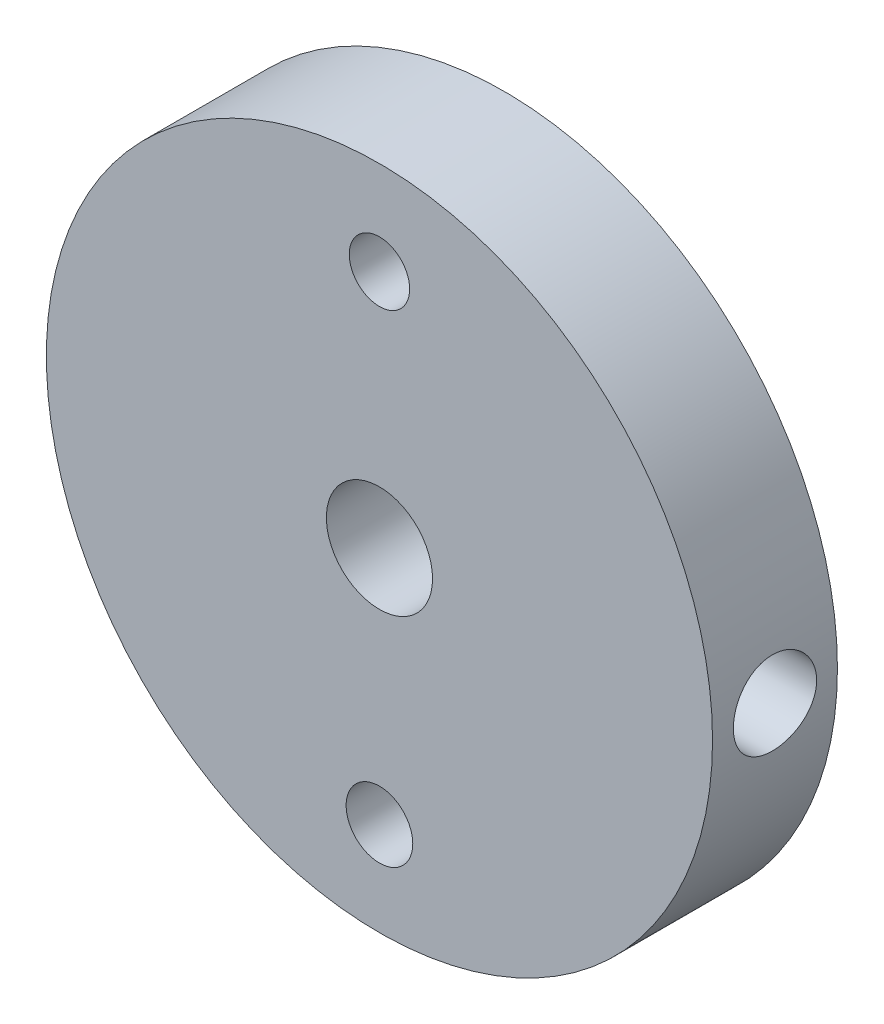
ISO-10303-21;
HEADER;
FILE_DESCRIPTION(('STEP AP214'),'2;1');
FILE_NAME('part.step','',(''),(''),'','','');
FILE_SCHEMA(('AUTOMOTIVE_DESIGN { 1 0 10303 214 1 1 1 1 }'));
ENDSEC;
DATA;
#1=APPLICATION_CONTEXT('core data for automotive mechanical design processes');
#2=APPLICATION_PROTOCOL_DEFINITION('international standard','automotive_design',2000,#1);
#3=PRODUCT_CONTEXT('',#1,'mechanical');
#4=PRODUCT('Part','Part','',(#3));
#5=PRODUCT_RELATED_PRODUCT_CATEGORY('part','',(#4));
#6=PRODUCT_DEFINITION_FORMATION('','',#4);
#7=PRODUCT_DEFINITION_CONTEXT('part definition',#1,'design');
#8=PRODUCT_DEFINITION('design','',#6,#7);
#9=PRODUCT_DEFINITION_SHAPE('','',#8);
#10=(LENGTH_UNIT() NAMED_UNIT(*) SI_UNIT(.MILLI.,.METRE.));
#11=(NAMED_UNIT(*) PLANE_ANGLE_UNIT() SI_UNIT($,.RADIAN.));
#12=(NAMED_UNIT(*) SI_UNIT($,.STERADIAN.) SOLID_ANGLE_UNIT());
#13=UNCERTAINTY_MEASURE_WITH_UNIT(LENGTH_MEASURE(1.E-05),#10,'distance_accuracy_value','');
#14=(GEOMETRIC_REPRESENTATION_CONTEXT(3) GLOBAL_UNCERTAINTY_ASSIGNED_CONTEXT((#13)) GLOBAL_UNIT_ASSIGNED_CONTEXT((#10,
#11,#12)) REPRESENTATION_CONTEXT('',''));
#15=CARTESIAN_POINT('',(0.,0.,0.));
#16=DIRECTION('',(0.,0.,1.));
#17=DIRECTION('',(1.,0.,0.));
#18=AXIS2_PLACEMENT_3D('',#15,#16,#17);
#19=CARTESIAN_POINT('',(0.,0.,-0.5));
#20=DIRECTION('',(0.,0.,1.));
#21=DIRECTION('',(1.,0.,0.));
#22=AXIS2_PLACEMENT_3D('',#19,#20,#21);
#23=PLANE('',#22);
#24=CARTESIAN_POINT('',(0.,0.,-0.5));
#25=DIRECTION('',(0.,0.,1.));
#26=DIRECTION('',(1.,0.,0.));
#27=AXIS2_PLACEMENT_3D('',#24,#25,#26);
#28=CIRCLE('',#27,2.55);
#29=CARTESIAN_POINT('',(2.55,0.,-0.5));
#30=VERTEX_POINT('',#29);
#31=EDGE_CURVE('E29',#30,#30,#28,.T.);
#32=ORIENTED_EDGE('',*,*,#31,.T.);
#33=EDGE_LOOP('',(#32));
#34=FACE_BOUND('',#33,.T.);
#35=CARTESIAN_POINT('',(0.,0.,-0.5));
#36=DIRECTION('',(0.,0.,1.));
#37=DIRECTION('',(1.,0.,0.));
#38=AXIS2_PLACEMENT_3D('',#35,#36,#37);
#39=CIRCLE('',#38,4.5);
#40=CARTESIAN_POINT('',(4.5,0.,-0.5));
#41=VERTEX_POINT('',#40);
#42=EDGE_CURVE('E11',#41,#41,#39,.T.);
#43=ORIENTED_EDGE('',*,*,#42,.F.);
#44=EDGE_LOOP('',(#43));
#45=FACE_BOUND('',#44,.T.);
#46=ADVANCED_FACE('F17',(#34,#45),#23,.F.);
#47=CARTESIAN_POINT('',(0.,11.5,-9.));
#48=DIRECTION('',(0.,0.,1.));
#49=DIRECTION('',(1.,0.,0.));
#50=AXIS2_PLACEMENT_3D('',#47,#48,#49);
#51=CYLINDRICAL_SURFACE('',#50,1.45);
#52=CARTESIAN_POINT('',(0.,11.5,6.));
#53=DIRECTION('',(0.,0.,1.));
#54=DIRECTION('',(1.,0.,0.));
#55=AXIS2_PLACEMENT_3D('',#52,#53,#54);
#56=CIRCLE('',#55,1.45);
#57=CARTESIAN_POINT('',(1.45,11.5,6.));
#58=VERTEX_POINT('',#57);
#59=EDGE_CURVE('E84',#58,#58,#56,.T.);
#60=ORIENTED_EDGE('',*,*,#59,.T.);
#61=EDGE_LOOP('',(#60));
#62=FACE_BOUND('',#61,.T.);
#63=CARTESIAN_POINT('',(0.,11.5,0.));
#64=DIRECTION('',(0.,0.,1.));
#65=DIRECTION('',(1.,0.,0.));
#66=AXIS2_PLACEMENT_3D('',#63,#64,#65);
#67=CIRCLE('',#66,1.45);
#68=CARTESIAN_POINT('',(1.45,11.5,0.));
#69=VERTEX_POINT('',#68);
#70=EDGE_CURVE('E83',#69,#69,#67,.T.);
#71=ORIENTED_EDGE('',*,*,#70,.F.);
#72=EDGE_LOOP('',(#71));
#73=FACE_BOUND('',#72,.T.);
#74=ADVANCED_FACE('F19',(#62,#73),#51,.F.);
#75=CARTESIAN_POINT('',(0.,0.,-0.5));
#76=DIRECTION('',(0.,0.,1.));
#77=DIRECTION('',(1.,0.,0.));
#78=AXIS2_PLACEMENT_3D('',#75,#76,#77);
#79=CYLINDRICAL_SURFACE('',#78,4.5);
#80=CARTESIAN_POINT('',(0.,0.,0.));
#81=DIRECTION('',(0.,0.,1.));
#82=DIRECTION('',(1.,0.,0.));
#83=AXIS2_PLACEMENT_3D('',#80,#81,#82);
#84=CIRCLE('',#83,4.5);
#85=CARTESIAN_POINT('',(4.5,0.,0.));
#86=VERTEX_POINT('',#85);
#87=EDGE_CURVE('E91',#86,#86,#84,.T.);
#88=ORIENTED_EDGE('',*,*,#87,.F.);
#89=EDGE_LOOP('',(#88));
#90=FACE_BOUND('',#89,.T.);
#91=ORIENTED_EDGE('',*,*,#42,.T.);
#92=EDGE_LOOP('',(#91));
#93=FACE_BOUND('',#92,.T.);
#94=ADVANCED_FACE('F146',(#90,#93),#79,.T.);
#95=CARTESIAN_POINT('',(0.,-11.5,-9.));
#96=DIRECTION('',(0.,0.,1.));
#97=DIRECTION('',(1.,0.,0.));
#98=AXIS2_PLACEMENT_3D('',#95,#96,#97);
#99=CYLINDRICAL_SURFACE('',#98,1.6);
#100=CARTESIAN_POINT('',(0.,-11.5,6.));
#101=DIRECTION('',(0.,0.,1.));
#102=DIRECTION('',(1.,0.,0.));
#103=AXIS2_PLACEMENT_3D('',#100,#101,#102);
#104=CIRCLE('',#103,1.6);
#105=CARTESIAN_POINT('',(1.6,-11.5,6.));
#106=VERTEX_POINT('',#105);
#107=EDGE_CURVE('E89',#106,#106,#104,.T.);
#108=ORIENTED_EDGE('',*,*,#107,.T.);
#109=EDGE_LOOP('',(#108));
#110=FACE_BOUND('',#109,.T.);
#111=CARTESIAN_POINT('',(0.,-11.5,0.));
#112=DIRECTION('',(0.,0.,1.));
#113=DIRECTION('',(1.,0.,0.));
#114=AXIS2_PLACEMENT_3D('',#111,#112,#113);
#115=CIRCLE('',#114,1.6);
#116=CARTESIAN_POINT('',(1.6,-11.5,0.));
#117=VERTEX_POINT('',#116);
#118=EDGE_CURVE('E95',#117,#117,#115,.T.);
#119=ORIENTED_EDGE('',*,*,#118,.F.);
#120=EDGE_LOOP('',(#119));
#121=FACE_BOUND('',#120,.T.);
#122=ADVANCED_FACE('F155',(#110,#121),#99,.F.);
#123=CARTESIAN_POINT('',(0.,0.,-9.));
#124=DIRECTION('',(0.,0.,1.));
#125=DIRECTION('',(1.,0.,0.));
#126=AXIS2_PLACEMENT_3D('',#123,#124,#125);
#127=CYLINDRICAL_SURFACE('',#126,2.55);
#128=CARTESIAN_POINT('',(2.55,0.,5.));
#129=CARTESIAN_POINT('',(2.55,-0.143433789915,5.));
#130=CARTESIAN_POINT('',(2.540318123503,-0.285578712188,4.987655933973));
#131=CARTESIAN_POINT('',(2.521282870783,-0.424326217447,4.963384482312));
#132=CARTESIAN_POINT('',(2.493881524397,-0.557636828044,4.928231523473));
#133=CARTESIAN_POINT('',(2.459743916372,-0.683653083589,4.883867983576));
#134=CARTESIAN_POINT('',(2.403040490777,-0.855082973136,4.808962107605));
#135=CARTESIAN_POINT('',(2.3840127446,-0.907708024537,4.783668927602));
#136=CARTESIAN_POINT('',(2.364048594397,-0.958664992761,4.756937023337));
#137=CARTESIAN_POINT('',(2.343273662976,-1.007961756108,4.72888597742));
#138=CARTESIAN_POINT('',(2.321806921084,-1.055612057131,4.699624633319));
#139=CARTESIAN_POINT('',(2.248172331567,-1.209330717978,4.598176783635));
#140=CARTESIAN_POINT('',(2.193380907861,-1.308179709006,4.520971151452));
#141=CARTESIAN_POINT('',(2.136712750365,-1.398630616271,4.438732939321));
#142=CARTESIAN_POINT('',(2.079244204251,-1.481195946589,4.352136757511));
#143=CARTESIAN_POINT('',(2.021918554628,-1.556314302037,4.261525672887));
#144=CARTESIAN_POINT('',(1.908850827588,-1.693155434938,4.071058529297));
#145=CARTESIAN_POINT('',(1.853138298997,-1.754680989568,3.971086138234));
#146=CARTESIAN_POINT('',(1.799769810154,-1.809068532536,3.867157180575));
#147=CARTESIAN_POINT('',(1.75010755171,-1.856241859742,3.759361250052));
#148=CARTESIAN_POINT('',(1.705878222148,-1.896010564763,3.647709435609));
#149=CARTESIAN_POINT('',(1.642023456379,-1.951290362946,3.447418374779));
#150=CARTESIAN_POINT('',(1.618882846096,-1.970529888094,3.360304932073));
#151=CARTESIAN_POINT('',(1.600677648898,-1.985170923148,3.271525480357));
#152=CARTESIAN_POINT('',(1.58821068845,-1.995031488424,3.181624169926));
#153=CARTESIAN_POINT('',(1.581929201956,-2.,3.090999678952));
#154=CARTESIAN_POINT('',(1.581929201956,-2.,2.941039536947));
#155=CARTESIAN_POINT('',(1.584565797331,-1.997914149382,2.882136005291));
#156=CARTESIAN_POINT('',(1.58983157549,-1.993750229842,2.823426582581));
#157=CARTESIAN_POINT('',(1.597638860171,-1.987531397734,2.765069238017));
#158=CARTESIAN_POINT('',(1.60782426011,-1.979306961668,2.707242956298));
#159=CARTESIAN_POINT('',(1.627109253851,-1.963439995793,2.61793478821));
#160=CARTESIAN_POINT('',(1.634751042686,-1.957103368972,2.585939562641));
#161=CARTESIAN_POINT('',(1.643043472109,-1.950162658573,2.554172287288));
#162=CARTESIAN_POINT('',(1.651948912507,-1.942628268002,2.522645281308));
#163=CARTESIAN_POINT('',(1.661427216762,-1.934511625148,2.491373180476));
#164=CARTESIAN_POINT('',(1.708400679281,-1.893743063247,2.345878025455));
#165=CARTESIAN_POINT('',(1.752538837234,-1.853942882758,2.235280111935));
#166=CARTESIAN_POINT('',(1.801960911353,-1.806863576854,2.128483247859));
#167=CARTESIAN_POINT('',(1.854990413464,-1.752687896564,2.025496183003));
#168=CARTESIAN_POINT('',(1.910304328047,-1.691483563223,1.92640276113));
#169=CARTESIAN_POINT('',(2.02271691346,-1.555260151512,1.737220405789));
#170=CARTESIAN_POINT('',(2.079792047166,-1.480389356262,1.647049015003));
#171=CARTESIAN_POINT('',(2.137001534681,-1.398133127281,1.560860680995));
#172=CARTESIAN_POINT('',(2.193413608472,-1.308058251081,1.478995428729));
#173=CARTESIAN_POINT('',(2.247965647699,-1.209659171581,1.40211938395));
#174=CARTESIAN_POINT('',(2.320950482127,-1.057442671778,1.301550565699));
#175=CARTESIAN_POINT('',(2.341996397756,-1.010832701997,1.27285209404));
#176=CARTESIAN_POINT('',(2.362382237523,-0.962644388277,1.245311482408));
#177=CARTESIAN_POINT('',(2.381996650547,-0.912864178566,1.219030369531));
#178=CARTESIAN_POINT('',(2.400722088536,-0.861483852139,1.194120388187));
#179=CARTESIAN_POINT('',(2.457876041694,-0.690521550626,1.118559600579));
#180=CARTESIAN_POINT('',(2.492681065144,-0.563443903807,1.073308837442));
#181=CARTESIAN_POINT('',(2.520651931525,-0.42887704138,1.037420059833));
#182=CARTESIAN_POINT('',(2.540100753596,-0.288712989029,1.012621190695));
#183=CARTESIAN_POINT('',(2.55,-0.145034908245,1.));
#184=CARTESIAN_POINT('',(2.55,0.,1.));
#185=B_SPLINE_CURVE_WITH_KNOTS('',6,(#128,#129,#130,#131,#132,#133,#134,#135,#136,#137,#138,
#139,#140,#141,#142,#143,#144,#145,#146,#147,#148,#149,#150,#151,#152,#153,#154,#155,#156,#157,
#158,#159,#160,#161,#162,#163,#164,#165,#166,#167,#168,#169,#170,#171,#172,#173,#174,#175,#176,
#177,#178,#179,#180,#181,#182,#183,#184),.UNSPECIFIED.,.F.,.F.,(7,5,5,5,5,5,5,5,5,5,5,7),(0.,
0.11243420721,0.164550530206,0.286503125615,0.410154620921,0.500727497059,0.559411426263,
0.592521081216,0.714806799616,0.835833426182,0.886710678629,1.),.UNSPECIFIED.);
#186=CARTESIAN_POINT('',(2.55,0.,5.));
#187=VERTEX_POINT('',#186);
#188=CARTESIAN_POINT('',(2.55,0.,1.));
#189=VERTEX_POINT('',#188);
#190=EDGE_CURVE('E63',#187,#189,#185,.T.);
#191=ORIENTED_EDGE('',*,*,#190,.T.);
#192=CARTESIAN_POINT('',(2.55,0.,1.));
#193=CARTESIAN_POINT('',(2.55,0.143433789917,1.));
#194=CARTESIAN_POINT('',(2.540318123502,0.285578712187,1.012344066028));
#195=CARTESIAN_POINT('',(2.521282870784,0.424326217445,1.036615517688));
#196=CARTESIAN_POINT('',(2.493881524398,0.557636828043,1.071768476527));
#197=CARTESIAN_POINT('',(2.459743916372,0.683653083591,1.116132016425));
#198=CARTESIAN_POINT('',(2.403040494137,0.855082962978,1.191037887956));
#199=CARTESIAN_POINT('',(2.384012743443,0.907708026059,1.216331074043));
#200=CARTESIAN_POINT('',(2.364048590785,0.958665001791,1.243062981545));
#201=CARTESIAN_POINT('',(2.34327366219,1.007961759371,1.271114023561));
#202=CARTESIAN_POINT('',(2.321806924908,1.055612049149,1.300375361413));
#203=CARTESIAN_POINT('',(2.248172331567,1.209330717978,1.401823216365));
#204=CARTESIAN_POINT('',(2.193380907862,1.308179709006,1.479028848548));
#205=CARTESIAN_POINT('',(2.136712750365,1.398630616271,1.561267060679));
#206=CARTESIAN_POINT('',(2.079244204251,1.481195946589,1.647863242488));
#207=CARTESIAN_POINT('',(2.021918554628,1.556314302037,1.738474327113));
#208=CARTESIAN_POINT('',(1.908850827587,1.693155434938,1.928941470703));
#209=CARTESIAN_POINT('',(1.853138298997,1.754680989568,2.028913861766));
#210=CARTESIAN_POINT('',(1.799769810154,1.809068532537,2.132842819426));
#211=CARTESIAN_POINT('',(1.75010755171,1.856241859742,2.240638749947));
#212=CARTESIAN_POINT('',(1.705878222148,1.896010564763,2.352290564391));
#213=CARTESIAN_POINT('',(1.642023456379,1.951290362946,2.552581625221));
#214=CARTESIAN_POINT('',(1.618882846096,1.970529888094,2.639695067927));
#215=CARTESIAN_POINT('',(1.600677648898,1.985170923148,2.728474519643));
#216=CARTESIAN_POINT('',(1.58821068845,1.995031488424,2.818375830074));
#217=CARTESIAN_POINT('',(1.581929201956,2.,2.909000321048));
#218=CARTESIAN_POINT('',(1.581929201956,2.,3.058960463053));
#219=CARTESIAN_POINT('',(1.584565797331,1.997914149382,3.117863994709));
#220=CARTESIAN_POINT('',(1.58983157549,1.993750229842,3.176573417419));
#221=CARTESIAN_POINT('',(1.597638860171,1.987531397734,3.234930761983));
#222=CARTESIAN_POINT('',(1.60782426011,1.979306961668,3.292757043703));
#223=CARTESIAN_POINT('',(1.627109253851,1.963439995793,3.38206521179));
#224=CARTESIAN_POINT('',(1.634751042686,1.957103368972,3.41406043736));
#225=CARTESIAN_POINT('',(1.643043472109,1.950162658573,3.445827712712));
#226=CARTESIAN_POINT('',(1.651948912507,1.942628268002,3.477354718692));
#227=CARTESIAN_POINT('',(1.661427216762,1.934511625148,3.508626819524));
#228=CARTESIAN_POINT('',(1.708400679281,1.893743063247,3.654121974545));
#229=CARTESIAN_POINT('',(1.752538837234,1.853942882758,3.764719888066));
#230=CARTESIAN_POINT('',(1.801960911353,1.806863576855,3.871516752141));
#231=CARTESIAN_POINT('',(1.854990413464,1.752687896564,3.974503816997));
#232=CARTESIAN_POINT('',(1.910304328047,1.691483563223,4.07359723887));
#233=CARTESIAN_POINT('',(2.02271691346,1.555260151512,4.262779594211));
#234=CARTESIAN_POINT('',(2.079792047166,1.480389356262,4.352950984997));
#235=CARTESIAN_POINT('',(2.137001534681,1.39813312728,4.439139319005));
#236=CARTESIAN_POINT('',(2.193413608472,1.308058251081,4.521004571271));
#237=CARTESIAN_POINT('',(2.247965647699,1.209659171581,4.59788061605));
#238=CARTESIAN_POINT('',(2.320950482127,1.057442671778,4.698449434301));
#239=CARTESIAN_POINT('',(2.341996397756,1.010832701997,4.72714790596));
#240=CARTESIAN_POINT('',(2.362382237523,0.962644388277,4.754688517592));
#241=CARTESIAN_POINT('',(2.381996650547,0.912864178566,4.780969630469));
#242=CARTESIAN_POINT('',(2.400722088536,0.861483852139,4.805879611813));
#243=CARTESIAN_POINT('',(2.457876041694,0.690521550626,4.881440399421));
#244=CARTESIAN_POINT('',(2.492681065144,0.563443903807,4.926691162558));
#245=CARTESIAN_POINT('',(2.520651931525,0.42887704138,4.962579940167));
#246=CARTESIAN_POINT('',(2.540100753596,0.288712989029,4.987378809305));
#247=CARTESIAN_POINT('',(2.55,0.145034908245,5.));
#248=CARTESIAN_POINT('',(2.55,0.,5.));
#249=B_SPLINE_CURVE_WITH_KNOTS('',6,(#192,#193,#194,#195,#196,#197,#198,#199,#200,#201,#202,
#203,#204,#205,#206,#207,#208,#209,#210,#211,#212,#213,#214,#215,#216,#217,#218,#219,#220,#221,
#222,#223,#224,#225,#226,#227,#228,#229,#230,#231,#232,#233,#234,#235,#236,#237,#238,#239,#240,
#241,#242,#243,#244,#245,#246,#247,#248),.UNSPECIFIED.,.F.,.F.,(7,5,5,5,5,5,5,5,5,5,5,7),(0.,
0.112434242169,0.16455057162,0.286503160983,0.410154650158,0.500727521807,0.559411448101,
0.592521101413,0.714806813751,0.835833434319,0.886710684243,1.),.UNSPECIFIED.);
#250=EDGE_CURVE('E41',#189,#187,#249,.T.);
#251=ORIENTED_EDGE('',*,*,#250,.T.);
#252=EDGE_LOOP('',(#191,#251));
#253=FACE_BOUND('',#252,.T.);
#254=CARTESIAN_POINT('',(0.,0.,6.));
#255=DIRECTION('',(0.,0.,1.));
#256=DIRECTION('',(1.,0.,0.));
#257=AXIS2_PLACEMENT_3D('',#254,#255,#256);
#258=CIRCLE('',#257,2.55);
#259=CARTESIAN_POINT('',(2.55,0.,6.));
#260=VERTEX_POINT('',#259);
#261=EDGE_CURVE('E87',#260,#260,#258,.T.);
#262=ORIENTED_EDGE('',*,*,#261,.T.);
#263=EDGE_LOOP('',(#262));
#264=FACE_BOUND('',#263,.T.);
#265=ORIENTED_EDGE('',*,*,#31,.F.);
#266=EDGE_LOOP('',(#265));
#267=FACE_BOUND('',#266,.T.);
#268=ADVANCED_FACE('F124',(#253,#264,#267),#127,.F.);
#269=CARTESIAN_POINT('',(0.,0.,6.));
#270=DIRECTION('',(0.,0.,1.));
#271=DIRECTION('',(1.,0.,0.));
#272=AXIS2_PLACEMENT_3D('',#269,#270,#271);
#273=PLANE('',#272);
#274=ORIENTED_EDGE('',*,*,#59,.F.);
#275=EDGE_LOOP('',(#274));
#276=FACE_BOUND('',#275,.T.);
#277=ORIENTED_EDGE('',*,*,#261,.F.);
#278=EDGE_LOOP('',(#277));
#279=FACE_BOUND('',#278,.T.);
#280=ORIENTED_EDGE('',*,*,#107,.F.);
#281=EDGE_LOOP('',(#280));
#282=FACE_BOUND('',#281,.T.);
#283=CARTESIAN_POINT('',(0.,0.,6.));
#284=DIRECTION('',(0.,0.,1.));
#285=DIRECTION('',(1.,0.,0.));
#286=AXIS2_PLACEMENT_3D('',#283,#284,#285);
#287=CIRCLE('',#286,16.);
#288=CARTESIAN_POINT('',(16.,0.,6.));
#289=VERTEX_POINT('',#288);
#290=EDGE_CURVE('E67',#289,#289,#287,.T.);
#291=ORIENTED_EDGE('',*,*,#290,.T.);
#292=EDGE_LOOP('',(#291));
#293=FACE_BOUND('',#292,.T.);
#294=ADVANCED_FACE('F136',(#276,#279,#282,#293),#273,.T.);
#295=CARTESIAN_POINT('',(0.,0.,0.));
#296=DIRECTION('',(0.,0.,1.));
#297=DIRECTION('',(1.,0.,0.));
#298=AXIS2_PLACEMENT_3D('',#295,#296,#297);
#299=PLANE('',#298);
#300=ORIENTED_EDGE('',*,*,#70,.T.);
#301=EDGE_LOOP('',(#300));
#302=FACE_BOUND('',#301,.T.);
#303=ORIENTED_EDGE('',*,*,#87,.T.);
#304=EDGE_LOOP('',(#303));
#305=FACE_BOUND('',#304,.T.);
#306=ORIENTED_EDGE('',*,*,#118,.T.);
#307=EDGE_LOOP('',(#306));
#308=FACE_BOUND('',#307,.T.);
#309=CARTESIAN_POINT('',(0.,0.,0.));
#310=DIRECTION('',(0.,0.,1.));
#311=DIRECTION('',(1.,0.,0.));
#312=AXIS2_PLACEMENT_3D('',#309,#310,#311);
#313=CIRCLE('',#312,16.);
#314=CARTESIAN_POINT('',(16.,0.,0.));
#315=VERTEX_POINT('',#314);
#316=EDGE_CURVE('E64',#315,#315,#313,.T.);
#317=ORIENTED_EDGE('',*,*,#316,.F.);
#318=EDGE_LOOP('',(#317));
#319=FACE_BOUND('',#318,.T.);
#320=ADVANCED_FACE('F127',(#302,#305,#308,#319),#299,.F.);
#321=CARTESIAN_POINT('',(1.,0.,3.));
#322=DIRECTION('',(1.,0.,0.));
#323=DIRECTION('',(0.,0.,-1.));
#324=AXIS2_PLACEMENT_3D('',#321,#322,#323);
#325=CYLINDRICAL_SURFACE('',#324,2.);
#326=CARTESIAN_POINT('',(16.,0.,5.));
#327=CARTESIAN_POINT('',(16.,-0.265282733175,5.));
#328=CARTESIAN_POINT('',(15.994868399946,-0.523565850927,4.958948360532));
#329=CARTESIAN_POINT('',(15.985093350746,-0.767446675774,4.880741643134));
#330=CARTESIAN_POINT('',(15.971989038824,-0.99075557229,4.770699618145));
#331=CARTESIAN_POINT('',(15.957363075213,-1.188783290305,4.635504688728));
#332=CARTESIAN_POINT('',(15.942836704216,-1.358732732571,4.483111959815));
#333=CARTESIAN_POINT('',(15.915723553192,-1.646622930366,4.156564629383));
#334=CARTESIAN_POINT('',(15.902856843438,-1.766426969196,3.977444487879));
#335=CARTESIAN_POINT('',(15.891840399295,-1.860708012411,3.789516456637));
#336=CARTESIAN_POINT('',(15.883256789404,-1.930558342596,3.595767729362));
#337=CARTESIAN_POINT('',(15.877426723381,-1.976832111721,3.398427454952));
#338=CARTESIAN_POINT('',(15.874507866388,-2.,3.199291497373));
#339=CARTESIAN_POINT('',(15.874507866388,-2.,2.800708960997));
#340=CARTESIAN_POINT('',(15.877426706841,-1.976832238155,2.601568914693));
#341=CARTESIAN_POINT('',(15.883256993945,-1.930556720887,2.404226094254));
#342=CARTESIAN_POINT('',(15.891840742762,-1.860705325336,2.210479865112));
#343=CARTESIAN_POINT('',(15.902856777642,-1.766426706559,2.022557728117));
#344=CARTESIAN_POINT('',(15.91572315392,-1.646627169878,1.843440179399));
#345=CARTESIAN_POINT('',(15.942831495131,-1.358788043171,1.516950777746));
#346=CARTESIAN_POINT('',(15.957359385073,-1.188834733902,1.3645220509));
#347=CARTESIAN_POINT('',(15.971991236235,-0.990749867194,1.229272950442));
#348=CARTESIAN_POINT('',(15.985100026003,-0.767362072511,1.119205085013));
#349=CARTESIAN_POINT('',(15.994873072944,-0.523426708763,1.041014232676));
#350=CARTESIAN_POINT('',(16.,-0.265161857582,1.));
#351=CARTESIAN_POINT('',(16.,0.,1.));
#352=B_SPLINE_CURVE_WITH_KNOTS('',7,(#326,#327,#328,#329,#330,#331,#332,#333,#334,#335,#336,
#337,#338,#339,#340,#341,#342,#343,#344,#345,#346,#347,#348,#349,#350,#351),.UNSPECIFIED.,.F.,
.F.,(8,6,6,6,8),(0.,0.245760658349,0.500052167845,0.75434309247,1.),.UNSPECIFIED.);
#353=CARTESIAN_POINT('',(16.,0.,5.));
#354=VERTEX_POINT('',#353);
#355=CARTESIAN_POINT('',(16.,0.,1.));
#356=VERTEX_POINT('',#355);
#357=EDGE_CURVE('E57',#354,#356,#352,.T.);
#358=ORIENTED_EDGE('',*,*,#357,.T.);
#359=CARTESIAN_POINT('',(16.,0.,1.));
#360=CARTESIAN_POINT('',(16.,0.265282733175,1.));
#361=CARTESIAN_POINT('',(15.994868399946,0.523565850927,1.041051639468));
#362=CARTESIAN_POINT('',(15.985093350746,0.767446675774,1.119258356865));
#363=CARTESIAN_POINT('',(15.971989038824,0.990755572291,1.229300381856));
#364=CARTESIAN_POINT('',(15.957363075213,1.188783290304,1.364495311272));
#365=CARTESIAN_POINT('',(15.942836704216,1.358732732571,1.516888040185));
#366=CARTESIAN_POINT('',(15.915723144854,1.646627266137,1.843440288584));
#367=CARTESIAN_POINT('',(15.902856904252,1.766425330213,2.022556181698));
#368=CARTESIAN_POINT('',(15.891840820071,1.860705108454,2.210478257099));
#369=CARTESIAN_POINT('',(15.883256749085,1.930558605706,2.40422811387));
#370=CARTESIAN_POINT('',(15.877426437165,1.976834400342,2.60157636306));
#371=CARTESIAN_POINT('',(15.874507866388,2.,2.800718435596));
#372=CARTESIAN_POINT('',(15.874507866388,2.,3.199291039003));
#373=CARTESIAN_POINT('',(15.877426706841,1.976832238155,3.398431085307));
#374=CARTESIAN_POINT('',(15.883256993945,1.930556720887,3.595773905745));
#375=CARTESIAN_POINT('',(15.891840742762,1.860705325336,3.789520134888));
#376=CARTESIAN_POINT('',(15.902856777642,1.766426706559,3.977442271883));
#377=CARTESIAN_POINT('',(15.91572315392,1.646627169878,4.156559820601));
#378=CARTESIAN_POINT('',(15.942834228763,1.358759017184,4.483082145774));
#379=CARTESIAN_POINT('',(15.957360969155,1.18881152121,4.635487708464));
#380=CARTESIAN_POINT('',(15.971989539513,0.990759954831,4.770708426434));
#381=CARTESIAN_POINT('',(15.985096412612,0.767412243577,4.880766202727));
#382=CARTESIAN_POINT('',(15.994870804446,0.523499373865,4.958967571188));
#383=CARTESIAN_POINT('',(16.,0.265220671575,5.));
#384=CARTESIAN_POINT('',(16.,0.,5.));
#385=B_SPLINE_CURVE_WITH_KNOTS('',7,(#359,#360,#361,#362,#363,#364,#365,#366,#367,#368,#369,
#370,#371,#372,#373,#374,#375,#376,#377,#378,#379,#380,#381,#382,#383,#384),.UNSPECIFIED.,.F.,
.F.,(8,6,6,6,8),(0.,0.245736655601,0.500010859468,0.75429715249,1.),.UNSPECIFIED.);
#386=EDGE_CURVE('E21',#356,#354,#385,.T.);
#387=ORIENTED_EDGE('',*,*,#386,.T.);
#388=EDGE_LOOP('',(#358,#387));
#389=FACE_BOUND('',#388,.T.);
#390=ORIENTED_EDGE('',*,*,#250,.F.);
#391=ORIENTED_EDGE('',*,*,#190,.F.);
#392=EDGE_LOOP('',(#390,#391));
#393=FACE_BOUND('',#392,.T.);
#394=ADVANCED_FACE('F65',(#389,#393),#325,.F.);
#395=CARTESIAN_POINT('',(0.,0.,0.));
#396=DIRECTION('',(0.,0.,1.));
#397=DIRECTION('',(1.,0.,0.));
#398=AXIS2_PLACEMENT_3D('',#395,#396,#397);
#399=CYLINDRICAL_SURFACE('',#398,16.);
#400=ORIENTED_EDGE('',*,*,#290,.F.);
#401=EDGE_LOOP('',(#400));
#402=FACE_BOUND('',#401,.T.);
#403=ORIENTED_EDGE('',*,*,#386,.F.);
#404=ORIENTED_EDGE('',*,*,#357,.F.);
#405=EDGE_LOOP('',(#403,#404));
#406=FACE_BOUND('',#405,.T.);
#407=ORIENTED_EDGE('',*,*,#316,.T.);
#408=EDGE_LOOP('',(#407));
#409=FACE_BOUND('',#408,.T.);
#410=ADVANCED_FACE('F59',(#402,#406,#409),#399,.T.);
#411=CLOSED_SHELL('',(#46,#74,#94,#122,#268,#294,#320,#394,#410));
#412=MANIFOLD_SOLID_BREP('B1',#411);
#413=ADVANCED_BREP_SHAPE_REPRESENTATION('',(#18,#412),#14);
#414=SHAPE_DEFINITION_REPRESENTATION(#9,#413);
ENDSEC;
END-ISO-10303-21;
